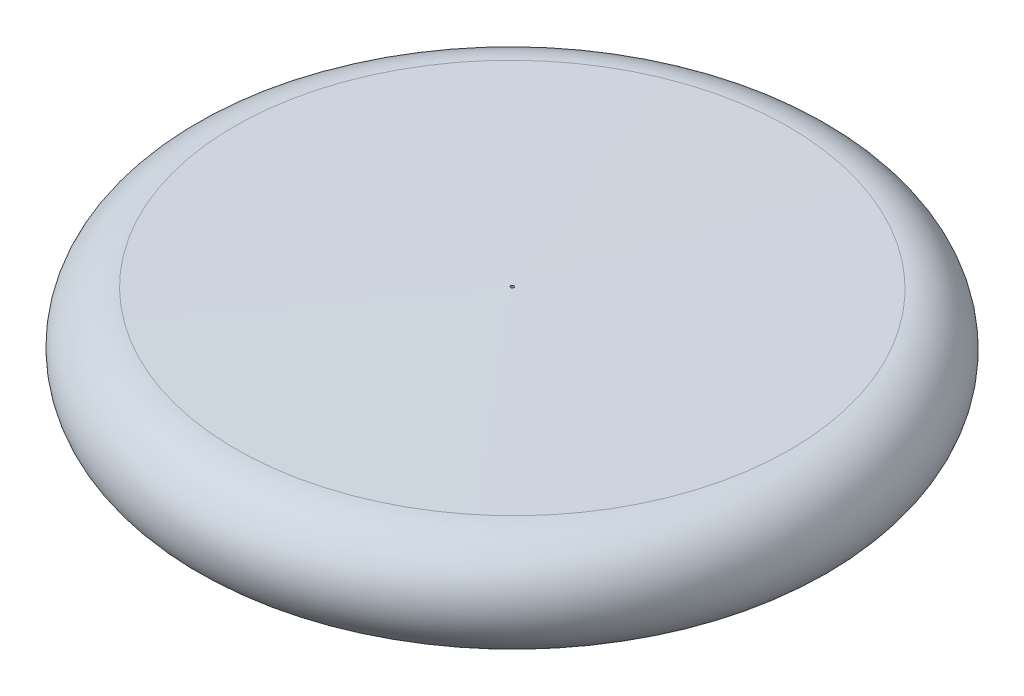
ISO-10303-21;
HEADER;
FILE_DESCRIPTION(('STEP AP214'),'2;1');
FILE_NAME('part.step','',(''),(''),'','','');
FILE_SCHEMA(('AUTOMOTIVE_DESIGN { 1 0 10303 214 1 1 1 1 }'));
ENDSEC;
DATA;
#1=APPLICATION_CONTEXT('core data for automotive mechanical design processes');
#2=APPLICATION_PROTOCOL_DEFINITION('international standard','automotive_design',2000,#1);
#3=PRODUCT_CONTEXT('',#1,'mechanical');
#4=PRODUCT('Part','Part','',(#3));
#5=PRODUCT_RELATED_PRODUCT_CATEGORY('part','',(#4));
#6=PRODUCT_DEFINITION_FORMATION('','',#4);
#7=PRODUCT_DEFINITION_CONTEXT('part definition',#1,'design');
#8=PRODUCT_DEFINITION('design','',#6,#7);
#9=PRODUCT_DEFINITION_SHAPE('','',#8);
#10=(LENGTH_UNIT() NAMED_UNIT(*) SI_UNIT(.MILLI.,.METRE.));
#11=(NAMED_UNIT(*) PLANE_ANGLE_UNIT() SI_UNIT($,.RADIAN.));
#12=(NAMED_UNIT(*) SI_UNIT($,.STERADIAN.) SOLID_ANGLE_UNIT());
#13=UNCERTAINTY_MEASURE_WITH_UNIT(LENGTH_MEASURE(1.E-05),#10,'distance_accuracy_value','');
#14=(GEOMETRIC_REPRESENTATION_CONTEXT(3) GLOBAL_UNCERTAINTY_ASSIGNED_CONTEXT((#13)) GLOBAL_UNIT_ASSIGNED_CONTEXT((#10,
#11,#12)) REPRESENTATION_CONTEXT('',''));
#15=CARTESIAN_POINT('',(0.,0.,0.));
#16=DIRECTION('',(0.,0.,1.));
#17=DIRECTION('',(1.,0.,0.));
#18=AXIS2_PLACEMENT_3D('',#15,#16,#17);
#19=CARTESIAN_POINT('',(30.2644320948081,8.14625161182747,0.));
#20=DIRECTION('',(0.00426167517145316,0.999990919021134,0.));
#21=DIRECTION('',(-0.999990919021134,0.00426167517145316,0.));
#22=AXIS2_PLACEMENT_3D('',#19,#20,#21);
#23=TOROIDAL_SURFACE('',#22,12.1960014545871,2.28984424492701);
#24=CARTESIAN_POINT('',(30.2546736110604,5.85644895476602,0.));
#25=DIRECTION('',(0.00426167517145316,0.999990919021134,0.));
#26=DIRECTION('',(-0.999990919021134,0.00426167517145316,0.));
#27=AXIS2_PLACEMENT_3D('',#24,#25,#26);
#28=CIRCLE('',#27,12.186242882222);
#29=CARTESIAN_POINT('',(42.4408058302684,5.80451514604156,0.));
#30=VERTEX_POINT('',#29);
#31=EDGE_CURVE('E10',#30,#30,#28,.T.);
#32=ORIENTED_EDGE('',*,*,#31,.T.);
#33=EDGE_LOOP('',(#32));
#34=FACE_BOUND('',#33,.T.);
#35=CARTESIAN_POINT('',(30.2741905785558,10.4360542688889,0.));
#36=DIRECTION('',(0.00426167517145316,0.999990919021134,0.));
#37=DIRECTION('',(-0.999990919021134,0.00426167517145316,0.));
#38=AXIS2_PLACEMENT_3D('',#35,#36,#37);
#39=CIRCLE('',#38,12.2057600269522);
#40=CARTESIAN_POINT('',(42.4798397652611,10.3840372844333,0.));
#41=VERTEX_POINT('',#40);
#42=EDGE_CURVE('E47',#41,#41,#39,.T.);
#43=ORIENTED_EDGE('',*,*,#42,.F.);
#44=EDGE_LOOP('',(#43));
#45=FACE_BOUND('',#44,.T.);
#46=ADVANCED_FACE('F33',(#34,#45),#23,.T.);
#47=CARTESIAN_POINT('',(30.2546736110604,5.85644895476602,0.));
#48=DIRECTION('',(-0.00426167517145316,-0.999990919021134,0.));
#49=DIRECTION('',(0.999990919021134,-0.00426167517145316,0.));
#50=AXIS2_PLACEMENT_3D('',#47,#48,#49);
#51=CONICAL_SURFACE('',#50,12.186242882222,1.56653463872334);
#52=CARTESIAN_POINT('',(30.2548940487478,5.90817408086025,0.));
#53=DIRECTION('',(0.00426167517145316,0.999990919021134,0.));
#54=DIRECTION('',(-0.999990919021134,0.00426167517145316,0.));
#55=AXIS2_PLACEMENT_3D('',#52,#53,#54);
#56=CIRCLE('',#55,0.0489672773836858);
#57=CARTESIAN_POINT('',(30.3038608814609,5.90796539823,0.));
#58=VERTEX_POINT('',#57);
#59=EDGE_CURVE('E39',#58,#58,#56,.T.);
#60=CARTESIAN_POINT('',(30.3038608814609,5.90796539823,0.));
#61=CARTESIAN_POINT('',(30.4302873913444,5.90688779143638,0.));
#62=CARTESIAN_POINT('',(30.5567139012278,5.90581018464275,0.));
#63=CARTESIAN_POINT('',(30.8095669209946,5.90365497105549,0.));
#64=CARTESIAN_POINT('',(30.935993430878,5.90257736426186,0.));
#65=CARTESIAN_POINT('',(31.1888464506448,5.9004221506746,0.));
#66=CARTESIAN_POINT('',(31.3152729605282,5.89934454388097,0.));
#67=CARTESIAN_POINT('',(31.5681259802951,5.89718933029371,0.));
#68=CARTESIAN_POINT('',(31.6945524901785,5.89611172350008,0.));
#69=CARTESIAN_POINT('',(31.9474055099453,5.89395650991282,0.));
#70=CARTESIAN_POINT('',(32.0738320198287,5.89287890311919,0.));
#71=CARTESIAN_POINT('',(32.3266850395955,5.89072368953193,0.));
#72=CARTESIAN_POINT('',(32.4531115494789,5.8896460827383,0.));
#73=CARTESIAN_POINT('',(32.7059645692457,5.88749086915104,0.));
#74=CARTESIAN_POINT('',(32.8323910791292,5.88641326235741,0.));
#75=CARTESIAN_POINT('',(33.085244098896,5.88425804877015,0.));
#76=CARTESIAN_POINT('',(33.2116706087794,5.88318044197652,0.));
#77=CARTESIAN_POINT('',(33.4645236285462,5.88102522838926,0.));
#78=CARTESIAN_POINT('',(33.5909501384296,5.87994762159563,0.));
#79=CARTESIAN_POINT('',(33.8438031581965,5.87779240800837,0.));
#80=CARTESIAN_POINT('',(33.9702296680799,5.87671480121475,0.));
#81=CARTESIAN_POINT('',(34.2230826878467,5.87455958762749,0.));
#82=CARTESIAN_POINT('',(34.3495091977301,5.87348198083386,0.));
#83=CARTESIAN_POINT('',(34.6023622174969,5.8713267672466,0.));
#84=CARTESIAN_POINT('',(34.7287887273803,5.87024916045297,0.));
#85=CARTESIAN_POINT('',(34.9816417471471,5.86809394686571,0.));
#86=CARTESIAN_POINT('',(35.1080682570305,5.86701634007208,0.));
#87=CARTESIAN_POINT('',(35.3609212767974,5.86486112648482,0.));
#88=CARTESIAN_POINT('',(35.4873477866808,5.86378351969119,0.));
#89=CARTESIAN_POINT('',(35.7402008064476,5.86162830610393,0.));
#90=CARTESIAN_POINT('',(35.866627316331,5.8605506993103,0.));
#91=CARTESIAN_POINT('',(36.1194803360978,5.85839548572304,0.));
#92=CARTESIAN_POINT('',(36.2459068459812,5.85731787892941,0.));
#93=CARTESIAN_POINT('',(36.4987598657481,5.85516266534215,0.));
#94=CARTESIAN_POINT('',(36.6251863756315,5.85408505854852,0.));
#95=CARTESIAN_POINT('',(36.8780393953983,5.85192984496126,0.));
#96=CARTESIAN_POINT('',(37.0044659052817,5.85085223816763,0.));
#97=CARTESIAN_POINT('',(37.2573189250485,5.84869702458037,0.));
#98=CARTESIAN_POINT('',(37.3837454349319,5.84761941778675,0.));
#99=CARTESIAN_POINT('',(37.6365984546988,5.84546420419949,0.));
#100=CARTESIAN_POINT('',(37.7630249645822,5.84438659740586,0.));
#101=CARTESIAN_POINT('',(38.015877984349,5.8422313838186,0.));
#102=CARTESIAN_POINT('',(38.1423044942324,5.84115377702497,0.));
#103=CARTESIAN_POINT('',(38.3951575139992,5.83899856343771,0.));
#104=CARTESIAN_POINT('',(38.5215840238826,5.83792095664408,0.));
#105=CARTESIAN_POINT('',(38.7744370436495,5.83576574305682,0.));
#106=CARTESIAN_POINT('',(38.9008635535329,5.83468813626319,0.));
#107=CARTESIAN_POINT('',(39.1537165732997,5.83253292267593,0.));
#108=CARTESIAN_POINT('',(39.2801430831831,5.8314553158823,0.));
#109=CARTESIAN_POINT('',(39.5329961029499,5.82930010229504,0.));
#110=CARTESIAN_POINT('',(39.6594226128333,5.82822249550141,0.));
#111=CARTESIAN_POINT('',(39.9122756326001,5.82606728191415,0.));
#112=CARTESIAN_POINT('',(40.0387021424836,5.82498967512052,0.));
#113=CARTESIAN_POINT('',(40.2915551622504,5.82283446153326,0.));
#114=CARTESIAN_POINT('',(40.4179816721338,5.82175685473963,0.));
#115=CARTESIAN_POINT('',(40.6708346919006,5.81960164115238,0.));
#116=CARTESIAN_POINT('',(40.797261201784,5.81852403435875,0.));
#117=CARTESIAN_POINT('',(41.0501142215508,5.81636882077149,0.));
#118=CARTESIAN_POINT('',(41.1765407314343,5.81529121397786,0.));
#119=CARTESIAN_POINT('',(41.4293937512011,5.8131360003906,0.));
#120=CARTESIAN_POINT('',(41.5558202610845,5.81205839359697,0.));
#121=CARTESIAN_POINT('',(41.8086732808513,5.80990318000971,0.));
#122=CARTESIAN_POINT('',(41.9350997907347,5.80882557321608,0.));
#123=CARTESIAN_POINT('',(42.1879528105015,5.80667035962882,0.));
#124=CARTESIAN_POINT('',(42.314379320385,5.80559275283519,0.));
#125=CARTESIAN_POINT('',(42.4408058302684,5.80451514604156,0.));
#126=B_SPLINE_CURVE_WITH_KNOTS('',3,(#60,#61,#62,#63,#64,#65,#66,#67,#68,#69,#70,#71,#72,#73,
#74,#75,#76,#77,#78,#79,#80,#81,#82,#83,#84,#85,#86,#87,#88,#89,#90,#91,#92,#93,#94,#95,#96,#97,
#98,#99,#100,#101,#102,#103,#104,#105,#106,#107,#108,#109,#110,#111,#112,#113,#114,#115,#116,
#117,#118,#119,#120,#121,#122,#123,#124,#125),.UNSPECIFIED.,.F.,.F.,(4,2,2,2,2,2,2,2,2,2,2,2,2,
2,2,2,2,2,2,2,2,2,2,2,2,2,2,2,2,2,2,2,4),(0.,0.379293307005696,0.758586614011392,
1.13787992101708,1.51717322802278,1.89646653502848,2.27575984203417,2.65505314903987,
3.03434645604556,3.41363976305126,3.79293307005695,4.17222637706265,4.55151968406834,
4.93081299107403,5.31010629807973,5.68939960508543,6.06869291209112,6.44798621909682,
6.82727952610251,7.20657283310821,7.5858661401139,7.96515944711959,8.34445275412529,
8.72374606113099,9.10303936813668,9.48233267514237,9.86162598214807,10.2409192891538,
10.6202125961595,10.9995059031652,11.3787992101709,11.7580925171766,12.1373858241822),.UNSPECIFIED.);
#127=EDGE_CURVE('BSEAM57',#58,#30,#126,.T.);
#128=ORIENTED_EDGE('',*,*,#59,.T.);
#129=ORIENTED_EDGE('',*,*,#31,.F.);
#130=ORIENTED_EDGE('',*,*,#127,.T.);
#131=ORIENTED_EDGE('',*,*,#127,.F.);
#132=EDGE_LOOP('',(#128,#130,#129,#131));
#133=FACE_BOUND('',#132,.T.);
#134=ADVANCED_FACE('F57',(#133),#51,.F.);
#135=CARTESIAN_POINT('',(30.2548940487478,5.90817408086025,0.));
#136=DIRECTION('',(0.00426167517145316,0.999990919021134,0.));
#137=DIRECTION('',(-0.999990919021134,0.00426167517145316,0.));
#138=AXIS2_PLACEMENT_3D('',#135,#136,#137);
#139=CONICAL_SURFACE('',#138,0.0489672773836864,0.0042616880715607);
#140=CARTESIAN_POINT('',(30.2744110162432,10.4877793949831,0.));
#141=DIRECTION('',(0.00426167517145316,0.999990919021134,0.));
#142=DIRECTION('',(-0.999990919021134,0.00426167517145316,0.));
#143=AXIS2_PLACEMENT_3D('',#140,#141,#142);
#144=CIRCLE('',#143,0.0684844221138865);
#145=CARTESIAN_POINT('',(30.3428948164513,10.4874875366218,0.));
#146=VERTEX_POINT('',#145);
#147=EDGE_CURVE('E43',#146,#146,#144,.T.);
#148=ORIENTED_EDGE('',*,*,#147,.T.);
#149=EDGE_LOOP('',(#148));
#150=FACE_BOUND('',#149,.T.);
#151=ORIENTED_EDGE('',*,*,#59,.F.);
#152=EDGE_LOOP('',(#151));
#153=FACE_BOUND('',#152,.T.);
#154=ADVANCED_FACE('F61',(#150,#153),#139,.F.);
#155=CARTESIAN_POINT('',(30.2744110162432,10.4877793949831,0.));
#156=DIRECTION('',(-0.00426167517145316,-0.999990919021134,0.));
#157=DIRECTION('',(0.999990919021134,-0.00426167517145316,0.));
#158=AXIS2_PLACEMENT_3D('',#155,#156,#157);
#159=CONICAL_SURFACE('',#158,0.0684844221138869,1.56653463872334);
#160=CARTESIAN_POINT('',(42.4798397652611,10.3840372844333,0.));
#161=CARTESIAN_POINT('',(42.3534132553777,10.385114891227,0.));
#162=CARTESIAN_POINT('',(42.2269867454942,10.3861924980206,0.));
#163=CARTESIAN_POINT('',(41.9741337257274,10.3883477116078,0.));
#164=CARTESIAN_POINT('',(41.8477072158439,10.3894253184015,0.));
#165=CARTESIAN_POINT('',(41.5948541960771,10.3915805319887,0.));
#166=CARTESIAN_POINT('',(41.4684276861936,10.3926581387824,0.));
#167=CARTESIAN_POINT('',(41.2155746664268,10.3948133523696,0.));
#168=CARTESIAN_POINT('',(41.0891481565433,10.3958909591633,0.));
#169=CARTESIAN_POINT('',(40.8362951367765,10.3980461727505,0.));
#170=CARTESIAN_POINT('',(40.709868626893,10.3991237795441,0.));
#171=CARTESIAN_POINT('',(40.4570156071262,10.4012789931314,0.));
#172=CARTESIAN_POINT('',(40.3305890972427,10.402356599925,0.));
#173=CARTESIAN_POINT('',(40.0777360774758,10.4045118135123,0.));
#174=CARTESIAN_POINT('',(39.9513095675924,10.4055894203059,0.));
#175=CARTESIAN_POINT('',(39.6984565478255,10.4077446338932,0.));
#176=CARTESIAN_POINT('',(39.5720300379421,10.4088222406868,0.));
#177=CARTESIAN_POINT('',(39.3191770181752,10.4109774542741,0.));
#178=CARTESIAN_POINT('',(39.1927505082918,10.4120550610677,0.));
#179=CARTESIAN_POINT('',(38.9398974885249,10.414210274655,0.));
#180=CARTESIAN_POINT('',(38.8134709786415,10.4152878814486,0.));
#181=CARTESIAN_POINT('',(38.5606179588746,10.4174430950359,0.));
#182=CARTESIAN_POINT('',(38.4341914489912,10.4185207018295,0.));
#183=CARTESIAN_POINT('',(38.1813384292243,10.4206759154167,0.));
#184=CARTESIAN_POINT('',(38.0549119193409,10.4217535222104,0.));
#185=CARTESIAN_POINT('',(37.802058899574,10.4239087357976,0.));
#186=CARTESIAN_POINT('',(37.6756323896906,10.4249863425913,0.));
#187=CARTESIAN_POINT('',(37.4227793699237,10.4271415561785,0.));
#188=CARTESIAN_POINT('',(37.2963528600403,10.4282191629722,0.));
#189=CARTESIAN_POINT('',(37.0434998402734,10.4303743765594,0.));
#190=CARTESIAN_POINT('',(36.91707333039,10.431451983353,0.));
#191=CARTESIAN_POINT('',(36.6642203106231,10.4336071969403,0.));
#192=CARTESIAN_POINT('',(36.5377938007397,10.4346848037339,0.));
#193=CARTESIAN_POINT('',(36.2849407809728,10.4368400173212,0.));
#194=CARTESIAN_POINT('',(36.1585142710893,10.4379176241148,0.));
#195=CARTESIAN_POINT('',(35.9056612513225,10.4400728377021,0.));
#196=CARTESIAN_POINT('',(35.779234741439,10.4411504444957,0.));
#197=CARTESIAN_POINT('',(35.5263817216722,10.443305658083,0.));
#198=CARTESIAN_POINT('',(35.3999552117887,10.4443832648766,0.));
#199=CARTESIAN_POINT('',(35.1471021920219,10.4465384784639,0.));
#200=CARTESIAN_POINT('',(35.0206756821384,10.4476160852575,0.));
#201=CARTESIAN_POINT('',(34.7678226623716,10.4497712988448,0.));
#202=CARTESIAN_POINT('',(34.6413961524881,10.4508489056384,0.));
#203=CARTESIAN_POINT('',(34.3885431327213,10.4530041192256,0.));
#204=CARTESIAN_POINT('',(34.2621166228378,10.4540817260193,0.));
#205=CARTESIAN_POINT('',(34.009263603071,10.4562369396065,0.));
#206=CARTESIAN_POINT('',(33.8828370931875,10.4573145464002,0.));
#207=CARTESIAN_POINT('',(33.6299840734207,10.4594697599874,0.));
#208=CARTESIAN_POINT('',(33.5035575635372,10.4605473667811,0.));
#209=CARTESIAN_POINT('',(33.2507045437703,10.4627025803683,0.));
#210=CARTESIAN_POINT('',(33.1242780338869,10.4637801871619,0.));
#211=CARTESIAN_POINT('',(32.87142501412,10.4659354007492,0.));
#212=CARTESIAN_POINT('',(32.7449985042366,10.4670130075428,0.));
#213=CARTESIAN_POINT('',(32.4921454844697,10.4691682211301,0.));
#214=CARTESIAN_POINT('',(32.3657189745863,10.4702458279237,0.));
#215=CARTESIAN_POINT('',(32.1128659548194,10.472401041511,0.));
#216=CARTESIAN_POINT('',(31.986439444936,10.4734786483046,0.));
#217=CARTESIAN_POINT('',(31.7335864251691,10.4756338618919,0.));
#218=CARTESIAN_POINT('',(31.6071599152857,10.4767114686855,0.));
#219=CARTESIAN_POINT('',(31.3543068955188,10.4788666822728,0.));
#220=CARTESIAN_POINT('',(31.2278803856354,10.4799442890664,0.));
#221=CARTESIAN_POINT('',(30.9750273658685,10.4820995026536,0.));
#222=CARTESIAN_POINT('',(30.8486008559851,10.4831771094473,0.));
#223=CARTESIAN_POINT('',(30.5957478362182,10.4853323230345,0.));
#224=CARTESIAN_POINT('',(30.4693213263348,10.4864099298282,0.));
#225=CARTESIAN_POINT('',(30.3428948164513,10.4874875366218,0.));
#226=B_SPLINE_CURVE_WITH_KNOTS('',3,(#160,#161,#162,#163,#164,#165,#166,#167,#168,#169,#170,
#171,#172,#173,#174,#175,#176,#177,#178,#179,#180,#181,#182,#183,#184,#185,#186,#187,#188,#189,
#190,#191,#192,#193,#194,#195,#196,#197,#198,#199,#200,#201,#202,#203,#204,#205,#206,#207,#208,
#209,#210,#211,#212,#213,#214,#215,#216,#217,#218,#219,#220,#221,#222,#223,#224,#225),
.UNSPECIFIED.,.F.,.F.,(4,2,2,2,2,2,2,2,2,2,2,2,2,2,2,2,2,2,2,2,2,2,2,2,2,2,2,2,2,2,2,2,4),(0.,
0.379293307005762,0.758586614011531,1.1378799210173,1.51717322802307,1.89646653502884,
2.2757598420346,2.65505314904038,3.03434645604614,3.41363976305191,3.79293307005768,
4.17222637706345,4.55151968406921,4.93081299107498,5.31010629808075,5.68939960508653,
6.0686929120923,6.44798621909807,6.82727952610383,7.2065728331096,7.58586614011537,
7.96515944712113,8.34445275412691,8.72374606113267,9.10303936813844,9.48233267514421,
9.86162598214998,10.2409192891557,10.6202125961615,10.9995059031673,11.3787992101731,
11.7580925171788,12.1373858241846),.UNSPECIFIED.);
#227=EDGE_CURVE('BSEAM53',#41,#146,#226,.T.);
#228=ORIENTED_EDGE('',*,*,#42,.T.);
#229=ORIENTED_EDGE('',*,*,#147,.F.);
#230=ORIENTED_EDGE('',*,*,#227,.T.);
#231=ORIENTED_EDGE('',*,*,#227,.F.);
#232=EDGE_LOOP('',(#228,#230,#229,#231));
#233=FACE_BOUND('',#232,.T.);
#234=ADVANCED_FACE('F53',(#233),#159,.T.);
#235=CLOSED_SHELL('',(#46,#134,#154,#234));
#236=MANIFOLD_SOLID_BREP('B2',#235);
#237=ADVANCED_BREP_SHAPE_REPRESENTATION('',(#18,#236),#14);
#238=SHAPE_DEFINITION_REPRESENTATION(#9,#237);
ENDSEC;
END-ISO-10303-21;
